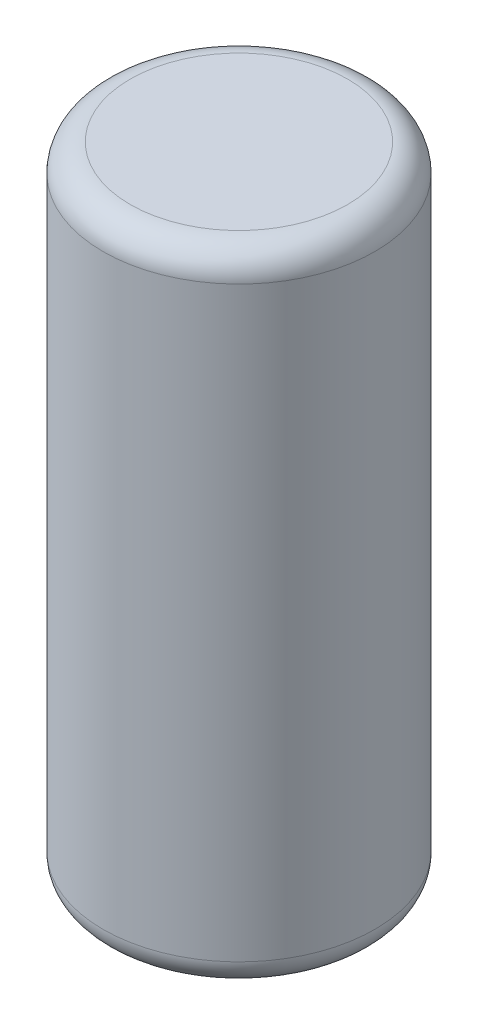
ISO-10303-21;
HEADER;
FILE_DESCRIPTION(('STEP AP214'),'2;1');
FILE_NAME('part.step','',(''),(''),'','','');
FILE_SCHEMA(('AUTOMOTIVE_DESIGN { 1 0 10303 214 1 1 1 1 }'));
ENDSEC;
DATA;
#1=APPLICATION_CONTEXT('core data for automotive mechanical design processes');
#2=APPLICATION_PROTOCOL_DEFINITION('international standard','automotive_design',2000,#1);
#3=PRODUCT_CONTEXT('',#1,'mechanical');
#4=PRODUCT('Part','Part','',(#3));
#5=PRODUCT_RELATED_PRODUCT_CATEGORY('part','',(#4));
#6=PRODUCT_DEFINITION_FORMATION('','',#4);
#7=PRODUCT_DEFINITION_CONTEXT('part definition',#1,'design');
#8=PRODUCT_DEFINITION('design','',#6,#7);
#9=PRODUCT_DEFINITION_SHAPE('','',#8);
#10=(LENGTH_UNIT() NAMED_UNIT(*) SI_UNIT(.MILLI.,.METRE.));
#11=(NAMED_UNIT(*) PLANE_ANGLE_UNIT() SI_UNIT($,.RADIAN.));
#12=(NAMED_UNIT(*) SI_UNIT($,.STERADIAN.) SOLID_ANGLE_UNIT());
#13=UNCERTAINTY_MEASURE_WITH_UNIT(LENGTH_MEASURE(1.E-05),#10,'distance_accuracy_value','');
#14=(GEOMETRIC_REPRESENTATION_CONTEXT(3) GLOBAL_UNCERTAINTY_ASSIGNED_CONTEXT((#13)) GLOBAL_UNIT_ASSIGNED_CONTEXT((#10,
#11,#12)) REPRESENTATION_CONTEXT('',''));
#15=CARTESIAN_POINT('',(0.,0.,0.));
#16=DIRECTION('',(0.,0.,1.));
#17=DIRECTION('',(1.,0.,0.));
#18=AXIS2_PLACEMENT_3D('',#15,#16,#17);
#19=CARTESIAN_POINT('',(0.,0.5,0.));
#20=DIRECTION('',(0.,1.,0.));
#21=DIRECTION('',(0.,0.,1.));
#22=AXIS2_PLACEMENT_3D('',#19,#20,#21);
#23=TOROIDAL_SURFACE('',#22,2.,0.5);
#24=CARTESIAN_POINT('',(0.,0.,0.));
#25=DIRECTION('',(0.,1.,0.));
#26=DIRECTION('',(0.,0.,1.));
#27=AXIS2_PLACEMENT_3D('',#24,#25,#26);
#28=CIRCLE('',#27,2.);
#29=CARTESIAN_POINT('',(0.,0.,2.));
#30=VERTEX_POINT('',#29);
#31=EDGE_CURVE('E10',#30,#30,#28,.T.);
#32=ORIENTED_EDGE('',*,*,#31,.T.);
#33=EDGE_LOOP('',(#32));
#34=FACE_BOUND('',#33,.T.);
#35=CARTESIAN_POINT('',(0.,0.5,0.));
#36=DIRECTION('',(0.,1.,0.));
#37=DIRECTION('',(0.,0.,1.));
#38=AXIS2_PLACEMENT_3D('',#35,#36,#37);
#39=CIRCLE('',#38,2.5);
#40=CARTESIAN_POINT('',(0.,0.5,2.5));
#41=VERTEX_POINT('',#40);
#42=EDGE_CURVE('E45',#41,#41,#39,.T.);
#43=ORIENTED_EDGE('',*,*,#42,.F.);
#44=EDGE_LOOP('',(#43));
#45=FACE_BOUND('',#44,.T.);
#46=ADVANCED_FACE('F31',(#34,#45),#23,.T.);
#47=CARTESIAN_POINT('',(2.,0.,0.));
#48=DIRECTION('',(0.,-1.,0.));
#49=DIRECTION('',(0.,0.,-1.));
#50=AXIS2_PLACEMENT_3D('',#47,#48,#49);
#51=PLANE('',#50);
#52=ORIENTED_EDGE('',*,*,#31,.F.);
#53=EDGE_LOOP('',(#52));
#54=FACE_BOUND('',#53,.T.);
#55=ADVANCED_FACE('F55',(#54),#51,.T.);
#56=CARTESIAN_POINT('',(0.,11.8,0.));
#57=DIRECTION('',(0.,1.,0.));
#58=DIRECTION('',(0.,0.,1.));
#59=AXIS2_PLACEMENT_3D('',#56,#57,#58);
#60=PLANE('',#59);
#61=CARTESIAN_POINT('',(0.,11.8,0.));
#62=DIRECTION('',(0.,1.,0.));
#63=DIRECTION('',(0.,0.,1.));
#64=AXIS2_PLACEMENT_3D('',#61,#62,#63);
#65=CIRCLE('',#64,2.);
#66=CARTESIAN_POINT('',(0.,11.8,2.));
#67=VERTEX_POINT('',#66);
#68=EDGE_CURVE('E37',#67,#67,#65,.T.);
#69=ORIENTED_EDGE('',*,*,#68,.T.);
#70=EDGE_LOOP('',(#69));
#71=FACE_BOUND('',#70,.T.);
#72=ADVANCED_FACE('F59',(#71),#60,.T.);
#73=CARTESIAN_POINT('',(0.,11.3,0.));
#74=DIRECTION('',(0.,1.,0.));
#75=DIRECTION('',(0.,0.,1.));
#76=AXIS2_PLACEMENT_3D('',#73,#74,#75);
#77=TOROIDAL_SURFACE('',#76,2.,0.5);
#78=CARTESIAN_POINT('',(0.,11.3,0.));
#79=DIRECTION('',(0.,1.,0.));
#80=DIRECTION('',(0.,0.,1.));
#81=AXIS2_PLACEMENT_3D('',#78,#79,#80);
#82=CIRCLE('',#81,2.5);
#83=CARTESIAN_POINT('',(0.,11.3,2.5));
#84=VERTEX_POINT('',#83);
#85=EDGE_CURVE('E41',#84,#84,#82,.T.);
#86=ORIENTED_EDGE('',*,*,#85,.T.);
#87=EDGE_LOOP('',(#86));
#88=FACE_BOUND('',#87,.T.);
#89=ORIENTED_EDGE('',*,*,#68,.F.);
#90=EDGE_LOOP('',(#89));
#91=FACE_BOUND('',#90,.T.);
#92=ADVANCED_FACE('F64',(#88,#91),#77,.T.);
#93=CARTESIAN_POINT('',(0.,-0.00219357871488954,0.));
#94=DIRECTION('',(0.,1.,0.));
#95=DIRECTION('',(0.,0.,1.));
#96=AXIS2_PLACEMENT_3D('',#93,#94,#95);
#97=CYLINDRICAL_SURFACE('',#96,2.5);
#98=ORIENTED_EDGE('',*,*,#42,.T.);
#99=EDGE_LOOP('',(#98));
#100=FACE_BOUND('',#99,.T.);
#101=ORIENTED_EDGE('',*,*,#85,.F.);
#102=EDGE_LOOP('',(#101));
#103=FACE_BOUND('',#102,.T.);
#104=ADVANCED_FACE('F51',(#100,#103),#97,.T.);
#105=CLOSED_SHELL('',(#46,#55,#72,#92,#104));
#106=MANIFOLD_SOLID_BREP('B2',#105);
#107=ADVANCED_BREP_SHAPE_REPRESENTATION('',(#18,#106),#14);
#108=SHAPE_DEFINITION_REPRESENTATION(#9,#107);
ENDSEC;
END-ISO-10303-21;
